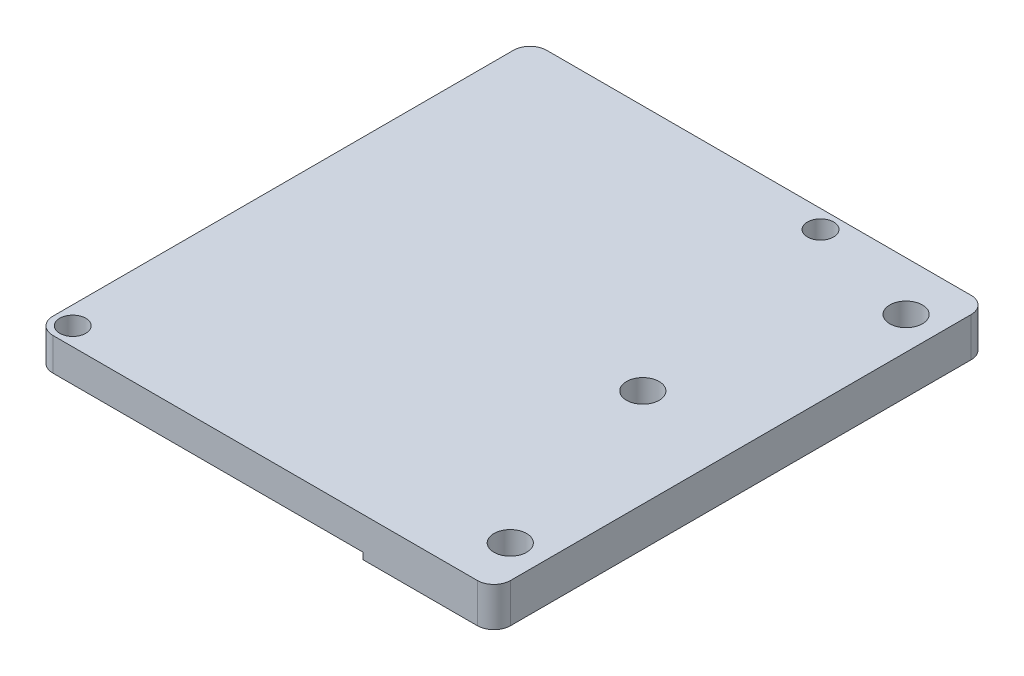
ISO-10303-21;
HEADER;
FILE_DESCRIPTION(('STEP AP214'),'2;1');
FILE_NAME('part.step','',(''),(''),'','','');
FILE_SCHEMA(('AUTOMOTIVE_DESIGN { 1 0 10303 214 1 1 1 1 }'));
ENDSEC;
DATA;
#1=APPLICATION_CONTEXT('core data for automotive mechanical design processes');
#2=APPLICATION_PROTOCOL_DEFINITION('international standard','automotive_design',2000,#1);
#3=PRODUCT_CONTEXT('',#1,'mechanical');
#4=PRODUCT('Part','Part','',(#3));
#5=PRODUCT_RELATED_PRODUCT_CATEGORY('part','',(#4));
#6=PRODUCT_DEFINITION_FORMATION('','',#4);
#7=PRODUCT_DEFINITION_CONTEXT('part definition',#1,'design');
#8=PRODUCT_DEFINITION('design','',#6,#7);
#9=PRODUCT_DEFINITION_SHAPE('','',#8);
#10=(LENGTH_UNIT() NAMED_UNIT(*) SI_UNIT(.MILLI.,.METRE.));
#11=(NAMED_UNIT(*) PLANE_ANGLE_UNIT() SI_UNIT($,.RADIAN.));
#12=(NAMED_UNIT(*) SI_UNIT($,.STERADIAN.) SOLID_ANGLE_UNIT());
#13=UNCERTAINTY_MEASURE_WITH_UNIT(LENGTH_MEASURE(1.E-05),#10,'distance_accuracy_value','');
#14=(GEOMETRIC_REPRESENTATION_CONTEXT(3) GLOBAL_UNCERTAINTY_ASSIGNED_CONTEXT((#13)) GLOBAL_UNIT_ASSIGNED_CONTEXT((#10,
#11,#12)) REPRESENTATION_CONTEXT('',''));
#15=CARTESIAN_POINT('',(0.,0.,0.));
#16=DIRECTION('',(0.,0.,1.));
#17=DIRECTION('',(1.,0.,0.));
#18=AXIS2_PLACEMENT_3D('',#15,#16,#17);
#19=CARTESIAN_POINT('',(60.038,-0.001000000000001,-60.565));
#20=DIRECTION('',(0.,1.,0.));
#21=DIRECTION('',(0.,0.,1.));
#22=AXIS2_PLACEMENT_3D('',#19,#20,#21);
#23=CYLINDRICAL_SURFACE('',#22,2.75000000000002);
#24=CARTESIAN_POINT('',(60.038,0.,-60.565));
#25=DIRECTION('',(0.,1.,0.));
#26=DIRECTION('',(0.,0.,1.));
#27=AXIS2_PLACEMENT_3D('',#24,#25,#26);
#28=CIRCLE('',#27,2.75000000000002);
#29=CARTESIAN_POINT('',(60.038,0.,-57.815));
#30=VERTEX_POINT('',#29);
#31=EDGE_CURVE('E215',#30,#30,#28,.F.);
#32=ORIENTED_EDGE('',*,*,#31,.T.);
#33=EDGE_LOOP('',(#32));
#34=FACE_BOUND('',#33,.T.);
#35=CARTESIAN_POINT('',(60.038,3.,-60.565));
#36=DIRECTION('',(0.,1.,0.));
#37=DIRECTION('',(0.,0.,1.));
#38=AXIS2_PLACEMENT_3D('',#35,#36,#37);
#39=CIRCLE('',#38,2.75000000000002);
#40=CARTESIAN_POINT('',(60.038,3.,-57.815));
#41=VERTEX_POINT('',#40);
#42=EDGE_CURVE('E58',#41,#41,#39,.F.);
#43=ORIENTED_EDGE('',*,*,#42,.F.);
#44=EDGE_LOOP('',(#43));
#45=FACE_BOUND('',#44,.T.);
#46=ADVANCED_FACE('F54',(#34,#45),#23,.F.);
#47=CARTESIAN_POINT('',(60.038,-0.001000000000001,60.565));
#48=DIRECTION('',(0.,1.,0.));
#49=DIRECTION('',(0.,0.,1.));
#50=AXIS2_PLACEMENT_3D('',#47,#48,#49);
#51=CYLINDRICAL_SURFACE('',#50,2.75000000000002);
#52=CARTESIAN_POINT('',(60.038,0.,60.565));
#53=DIRECTION('',(0.,1.,0.));
#54=DIRECTION('',(0.,0.,1.));
#55=AXIS2_PLACEMENT_3D('',#52,#53,#54);
#56=CIRCLE('',#55,2.75000000000002);
#57=CARTESIAN_POINT('',(60.038,0.,63.315));
#58=VERTEX_POINT('',#57);
#59=EDGE_CURVE('E219',#58,#58,#56,.F.);
#60=ORIENTED_EDGE('',*,*,#59,.T.);
#61=EDGE_LOOP('',(#60));
#62=FACE_BOUND('',#61,.T.);
#63=CARTESIAN_POINT('',(60.038,3.,60.565));
#64=DIRECTION('',(0.,1.,0.));
#65=DIRECTION('',(0.,0.,1.));
#66=AXIS2_PLACEMENT_3D('',#63,#64,#65);
#67=CIRCLE('',#66,2.75000000000002);
#68=CARTESIAN_POINT('',(60.038,3.,63.315));
#69=VERTEX_POINT('',#68);
#70=EDGE_CURVE('E209',#69,#69,#67,.F.);
#71=ORIENTED_EDGE('',*,*,#70,.F.);
#72=EDGE_LOOP('',(#71));
#73=FACE_BOUND('',#72,.T.);
#74=ADVANCED_FACE('F283',(#62,#73),#51,.F.);
#75=CARTESIAN_POINT('',(40.038,-0.001000000000001,0.));
#76=DIRECTION('',(0.,1.,0.));
#77=DIRECTION('',(0.,0.,1.));
#78=AXIS2_PLACEMENT_3D('',#75,#76,#77);
#79=CYLINDRICAL_SURFACE('',#78,2.75);
#80=CARTESIAN_POINT('',(40.038,0.,0.));
#81=DIRECTION('',(0.,1.,0.));
#82=DIRECTION('',(0.,0.,1.));
#83=AXIS2_PLACEMENT_3D('',#80,#81,#82);
#84=CIRCLE('',#83,2.75);
#85=CARTESIAN_POINT('',(40.038,0.,2.75));
#86=VERTEX_POINT('',#85);
#87=EDGE_CURVE('E224',#86,#86,#84,.F.);
#88=ORIENTED_EDGE('',*,*,#87,.T.);
#89=EDGE_LOOP('',(#88));
#90=FACE_BOUND('',#89,.T.);
#91=CARTESIAN_POINT('',(40.038,3.,0.));
#92=DIRECTION('',(0.,1.,0.));
#93=DIRECTION('',(0.,0.,1.));
#94=AXIS2_PLACEMENT_3D('',#91,#92,#93);
#95=CIRCLE('',#94,2.75);
#96=CARTESIAN_POINT('',(40.038,3.,2.75));
#97=VERTEX_POINT('',#96);
#98=EDGE_CURVE('E207',#97,#97,#95,.F.);
#99=ORIENTED_EDGE('',*,*,#98,.F.);
#100=EDGE_LOOP('',(#99));
#101=FACE_BOUND('',#100,.T.);
#102=ADVANCED_FACE('F288',(#90,#101),#79,.F.);
#103=CARTESIAN_POINT('',(-70.038,12.,-75.565));
#104=DIRECTION('',(1.,0.,0.));
#105=DIRECTION('',(0.,0.,-1.));
#106=AXIS2_PLACEMENT_3D('',#103,#104,#105);
#107=PLANE('',#106);
#108=DIRECTION('',(0.,0.,-1.));
#109=VECTOR('',#108,1.);
#110=CARTESIAN_POINT('',(-70.038,2.,75.565));
#111=LINE('',#110,#109);
#112=CARTESIAN_POINT('',(-70.038,2.,70.485));
#113=VERTEX_POINT('',#112);
#114=CARTESIAN_POINT('',(-70.038,2.,-70.485));
#115=VERTEX_POINT('',#114);
#116=EDGE_CURVE('E138',#113,#115,#111,.T.);
#117=ORIENTED_EDGE('',*,*,#116,.F.);
#118=DIRECTION('',(0.,-1.,0.));
#119=VECTOR('',#118,1.);
#120=CARTESIAN_POINT('',(-70.038,12.,70.485));
#121=LINE('',#120,#119);
#122=CARTESIAN_POINT('',(-70.038,12.,70.485));
#123=VERTEX_POINT('',#122);
#124=EDGE_CURVE('E204',#113,#123,#121,.F.);
#125=ORIENTED_EDGE('',*,*,#124,.T.);
#126=DIRECTION('',(0.,0.,1.));
#127=VECTOR('',#126,1.);
#128=CARTESIAN_POINT('',(-70.038,12.,-75.565));
#129=LINE('',#128,#127);
#130=CARTESIAN_POINT('',(-70.038,12.,-70.485));
#131=VERTEX_POINT('',#130);
#132=EDGE_CURVE('E166',#131,#123,#129,.T.);
#133=ORIENTED_EDGE('',*,*,#132,.F.);
#134=DIRECTION('',(0.,-1.,0.));
#135=VECTOR('',#134,1.);
#136=CARTESIAN_POINT('',(-70.038,12.,-70.485));
#137=LINE('',#136,#135);
#138=EDGE_CURVE('E202',#131,#115,#137,.T.);
#139=ORIENTED_EDGE('',*,*,#138,.T.);
#140=EDGE_LOOP('',(#117,#125,#133,#139));
#141=FACE_BOUND('',#140,.T.);
#142=ADVANCED_FACE('F267',(#141),#107,.F.);
#143=CARTESIAN_POINT('',(70.038,12.,-75.565));
#144=DIRECTION('',(-1.,0.,0.));
#145=DIRECTION('',(0.,0.,1.));
#146=AXIS2_PLACEMENT_3D('',#143,#144,#145);
#147=PLANE('',#146);
#148=DIRECTION('',(0.,0.,-1.));
#149=VECTOR('',#148,1.);
#150=CARTESIAN_POINT('',(70.038,12.,-75.565));
#151=LINE('',#150,#149);
#152=CARTESIAN_POINT('',(70.038,12.,70.485));
#153=VERTEX_POINT('',#152);
#154=CARTESIAN_POINT('',(70.038,12.,-70.485));
#155=VERTEX_POINT('',#154);
#156=EDGE_CURVE('E159',#153,#155,#151,.T.);
#157=ORIENTED_EDGE('',*,*,#156,.F.);
#158=DIRECTION('',(0.,-1.,0.));
#159=VECTOR('',#158,1.);
#160=CARTESIAN_POINT('',(70.038,12.,70.485));
#161=LINE('',#160,#159);
#162=CARTESIAN_POINT('',(70.038,0.,70.485));
#163=VERTEX_POINT('',#162);
#164=EDGE_CURVE('E179',#153,#163,#161,.T.);
#165=ORIENTED_EDGE('',*,*,#164,.T.);
#166=DIRECTION('',(0.,0.,-1.));
#167=VECTOR('',#166,1.);
#168=CARTESIAN_POINT('',(70.038,0.,-75.565));
#169=LINE('',#168,#167);
#170=CARTESIAN_POINT('',(70.038,0.,-70.485));
#171=VERTEX_POINT('',#170);
#172=EDGE_CURVE('E154',#163,#171,#169,.T.);
#173=ORIENTED_EDGE('',*,*,#172,.T.);
#174=DIRECTION('',(0.,-1.,0.));
#175=VECTOR('',#174,1.);
#176=CARTESIAN_POINT('',(70.038,12.,-70.485));
#177=LINE('',#176,#175);
#178=EDGE_CURVE('E172',#171,#155,#177,.F.);
#179=ORIENTED_EDGE('',*,*,#178,.T.);
#180=EDGE_LOOP('',(#157,#165,#173,#179));
#181=FACE_BOUND('',#180,.T.);
#182=ADVANCED_FACE('F254',(#181),#147,.F.);
#183=CARTESIAN_POINT('',(-70.038,12.,-75.565));
#184=DIRECTION('',(0.,0.,1.));
#185=DIRECTION('',(1.,0.,0.));
#186=AXIS2_PLACEMENT_3D('',#183,#184,#185);
#187=PLANE('',#186);
#188=DIRECTION('',(1.,0.,0.));
#189=VECTOR('',#188,1.);
#190=CARTESIAN_POINT('',(-70.038,2.,-75.565));
#191=LINE('',#190,#189);
#192=CARTESIAN_POINT('',(-64.958,2.,-75.565));
#193=VERTEX_POINT('',#192);
#194=CARTESIAN_POINT('',(30.038,2.,-75.565));
#195=VERTEX_POINT('',#194);
#196=EDGE_CURVE('E130',#193,#195,#191,.T.);
#197=ORIENTED_EDGE('',*,*,#196,.F.);
#198=DIRECTION('',(0.,-1.,0.));
#199=VECTOR('',#198,1.);
#200=CARTESIAN_POINT('',(-64.958,12.,-75.565));
#201=LINE('',#200,#199);
#202=CARTESIAN_POINT('',(-64.958,12.,-75.565));
#203=VERTEX_POINT('',#202);
#204=EDGE_CURVE('E14',#193,#203,#201,.F.);
#205=ORIENTED_EDGE('',*,*,#204,.T.);
#206=DIRECTION('',(-1.,0.,0.));
#207=VECTOR('',#206,1.);
#208=CARTESIAN_POINT('',(-70.038,12.,-75.565));
#209=LINE('',#208,#207);
#210=CARTESIAN_POINT('',(64.958,12.,-75.565));
#211=VERTEX_POINT('',#210);
#212=EDGE_CURVE('E162',#211,#203,#209,.T.);
#213=ORIENTED_EDGE('',*,*,#212,.F.);
#214=DIRECTION('',(0.,-1.,0.));
#215=VECTOR('',#214,1.);
#216=CARTESIAN_POINT('',(64.958,12.,-75.565));
#217=LINE('',#216,#215);
#218=CARTESIAN_POINT('',(64.958,0.,-75.565));
#219=VERTEX_POINT('',#218);
#220=EDGE_CURVE('E63',#211,#219,#217,.T.);
#221=ORIENTED_EDGE('',*,*,#220,.T.);
#222=DIRECTION('',(-1.,0.,0.));
#223=VECTOR('',#222,1.);
#224=CARTESIAN_POINT('',(-70.038,0.,-75.565));
#225=LINE('',#224,#223);
#226=CARTESIAN_POINT('',(30.038,0.,-75.565));
#227=VERTEX_POINT('',#226);
#228=EDGE_CURVE('E152',#219,#227,#225,.T.);
#229=ORIENTED_EDGE('',*,*,#228,.T.);
#230=DIRECTION('',(0.,-1.,0.));
#231=VECTOR('',#230,1.);
#232=CARTESIAN_POINT('',(30.038,2.,-75.565));
#233=LINE('',#232,#231);
#234=EDGE_CURVE('E143',#195,#227,#233,.T.);
#235=ORIENTED_EDGE('',*,*,#234,.F.);
#236=EDGE_LOOP('',(#197,#205,#213,#221,#229,#235));
#237=FACE_BOUND('',#236,.T.);
#238=ADVANCED_FACE('F149',(#237),#187,.F.);
#239=CARTESIAN_POINT('',(-70.038,12.,75.565));
#240=DIRECTION('',(0.,0.,-1.));
#241=DIRECTION('',(-1.,0.,0.));
#242=AXIS2_PLACEMENT_3D('',#239,#240,#241);
#243=PLANE('',#242);
#244=DIRECTION('',(1.,0.,0.));
#245=VECTOR('',#244,1.);
#246=CARTESIAN_POINT('',(-70.038,0.,75.565));
#247=LINE('',#246,#245);
#248=CARTESIAN_POINT('',(30.038,0.,75.565));
#249=VERTEX_POINT('',#248);
#250=CARTESIAN_POINT('',(64.958,0.,75.565));
#251=VERTEX_POINT('',#250);
#252=EDGE_CURVE('E163',#249,#251,#247,.T.);
#253=ORIENTED_EDGE('',*,*,#252,.T.);
#254=DIRECTION('',(0.,-1.,0.));
#255=VECTOR('',#254,1.);
#256=CARTESIAN_POINT('',(64.958,12.,75.565));
#257=LINE('',#256,#255);
#258=CARTESIAN_POINT('',(64.958,12.,75.565));
#259=VERTEX_POINT('',#258);
#260=EDGE_CURVE('E189',#251,#259,#257,.F.);
#261=ORIENTED_EDGE('',*,*,#260,.T.);
#262=DIRECTION('',(1.,0.,0.));
#263=VECTOR('',#262,1.);
#264=CARTESIAN_POINT('',(-70.038,12.,75.565));
#265=LINE('',#264,#263);
#266=CARTESIAN_POINT('',(-64.958,12.,75.565));
#267=VERTEX_POINT('',#266);
#268=EDGE_CURVE('E169',#267,#259,#265,.T.);
#269=ORIENTED_EDGE('',*,*,#268,.F.);
#270=DIRECTION('',(0.,-1.,0.));
#271=VECTOR('',#270,1.);
#272=CARTESIAN_POINT('',(-64.958,12.,75.565));
#273=LINE('',#272,#271);
#274=CARTESIAN_POINT('',(-64.958,2.,75.565));
#275=VERTEX_POINT('',#274);
#276=EDGE_CURVE('E186',#267,#275,#273,.T.);
#277=ORIENTED_EDGE('',*,*,#276,.T.);
#278=DIRECTION('',(-1.,0.,0.));
#279=VECTOR('',#278,1.);
#280=CARTESIAN_POINT('',(-70.038,2.,75.565));
#281=LINE('',#280,#279);
#282=CARTESIAN_POINT('',(30.038,2.,75.565));
#283=VERTEX_POINT('',#282);
#284=EDGE_CURVE('E147',#283,#275,#281,.T.);
#285=ORIENTED_EDGE('',*,*,#284,.F.);
#286=DIRECTION('',(0.,-1.,0.));
#287=VECTOR('',#286,1.);
#288=CARTESIAN_POINT('',(30.038,2.,75.565));
#289=LINE('',#288,#287);
#290=EDGE_CURVE('E146',#283,#249,#289,.T.);
#291=ORIENTED_EDGE('',*,*,#290,.T.);
#292=EDGE_LOOP('',(#253,#261,#269,#277,#285,#291));
#293=FACE_BOUND('',#292,.T.);
#294=ADVANCED_FACE('F244',(#293),#243,.F.);
#295=CARTESIAN_POINT('',(0.,12.,0.));
#296=DIRECTION('',(0.,1.,0.));
#297=DIRECTION('',(0.,0.,1.));
#298=AXIS2_PLACEMENT_3D('',#295,#296,#297);
#299=PLANE('',#298);
#300=CARTESIAN_POINT('',(60.038,12.,-60.565));
#301=DIRECTION('',(0.,1.,0.));
#302=DIRECTION('',(0.,0.,1.));
#303=AXIS2_PLACEMENT_3D('',#300,#301,#302);
#304=CIRCLE('',#303,5.);
#305=CARTESIAN_POINT('',(60.038,12.,-55.565));
#306=VERTEX_POINT('',#305);
#307=EDGE_CURVE('E452',#306,#306,#304,.T.);
#308=ORIENTED_EDGE('',*,*,#307,.F.);
#309=EDGE_LOOP('',(#308));
#310=FACE_BOUND('',#309,.T.);
#311=CARTESIAN_POINT('',(40.038,12.,0.));
#312=DIRECTION('',(0.,1.,0.));
#313=DIRECTION('',(0.,0.,1.));
#314=AXIS2_PLACEMENT_3D('',#311,#312,#313);
#315=CIRCLE('',#314,5.);
#316=CARTESIAN_POINT('',(40.038,12.,5.));
#317=VERTEX_POINT('',#316);
#318=EDGE_CURVE('E457',#317,#317,#315,.T.);
#319=ORIENTED_EDGE('',*,*,#318,.F.);
#320=EDGE_LOOP('',(#319));
#321=FACE_BOUND('',#320,.T.);
#322=CARTESIAN_POINT('',(60.038,12.,60.565));
#323=DIRECTION('',(0.,1.,0.));
#324=DIRECTION('',(0.,0.,1.));
#325=AXIS2_PLACEMENT_3D('',#322,#323,#324);
#326=CIRCLE('',#325,5.);
#327=CARTESIAN_POINT('',(60.038,12.,65.565));
#328=VERTEX_POINT('',#327);
#329=EDGE_CURVE('E463',#328,#328,#326,.T.);
#330=ORIENTED_EDGE('',*,*,#329,.F.);
#331=EDGE_LOOP('',(#330));
#332=FACE_BOUND('',#331,.T.);
#333=CARTESIAN_POINT('',(24.4499999999999,12.,-69.977));
#334=DIRECTION('',(0.,1.,0.));
#335=DIRECTION('',(0.,0.,1.));
#336=AXIS2_PLACEMENT_3D('',#333,#334,#335);
#337=CIRCLE('',#336,4.);
#338=CARTESIAN_POINT('',(24.4499999999999,12.,-65.977));
#339=VERTEX_POINT('',#338);
#340=EDGE_CURVE('E232',#339,#339,#337,.T.);
#341=ORIENTED_EDGE('',*,*,#340,.F.);
#342=EDGE_LOOP('',(#341));
#343=FACE_BOUND('',#342,.T.);
#344=CARTESIAN_POINT('',(-64.45,12.,69.977));
#345=DIRECTION('',(0.,1.,0.));
#346=DIRECTION('',(0.,0.,1.));
#347=AXIS2_PLACEMENT_3D('',#344,#345,#346);
#348=CIRCLE('',#347,4.00000000000001);
#349=CARTESIAN_POINT('',(-64.45,12.,73.977));
#350=VERTEX_POINT('',#349);
#351=EDGE_CURVE('E238',#350,#350,#348,.T.);
#352=ORIENTED_EDGE('',*,*,#351,.F.);
#353=EDGE_LOOP('',(#352));
#354=FACE_BOUND('',#353,.T.);
#355=ORIENTED_EDGE('',*,*,#268,.T.);
#356=CARTESIAN_POINT('',(64.958,12.,70.485));
#357=DIRECTION('',(0.,1.,0.));
#358=DIRECTION('',(0.,0.,1.));
#359=AXIS2_PLACEMENT_3D('',#356,#357,#358);
#360=CIRCLE('',#359,5.08);
#361=EDGE_CURVE('E197',#259,#153,#360,.T.);
#362=ORIENTED_EDGE('',*,*,#361,.T.);
#363=ORIENTED_EDGE('',*,*,#156,.T.);
#364=CARTESIAN_POINT('',(64.958,12.,-70.485));
#365=DIRECTION('',(0.,1.,0.));
#366=DIRECTION('',(0.,0.,1.));
#367=AXIS2_PLACEMENT_3D('',#364,#365,#366);
#368=CIRCLE('',#367,5.08);
#369=EDGE_CURVE('E191',#155,#211,#368,.T.);
#370=ORIENTED_EDGE('',*,*,#369,.T.);
#371=ORIENTED_EDGE('',*,*,#212,.T.);
#372=CARTESIAN_POINT('',(-64.958,12.,-70.485));
#373=DIRECTION('',(0.,1.,0.));
#374=DIRECTION('',(0.,0.,1.));
#375=AXIS2_PLACEMENT_3D('',#372,#373,#374);
#376=CIRCLE('',#375,5.08);
#377=EDGE_CURVE('E193',#203,#131,#376,.T.);
#378=ORIENTED_EDGE('',*,*,#377,.T.);
#379=ORIENTED_EDGE('',*,*,#132,.T.);
#380=CARTESIAN_POINT('',(-64.958,12.,70.485));
#381=DIRECTION('',(0.,1.,0.));
#382=DIRECTION('',(0.,0.,1.));
#383=AXIS2_PLACEMENT_3D('',#380,#381,#382);
#384=CIRCLE('',#383,5.08);
#385=EDGE_CURVE('E195',#123,#267,#384,.T.);
#386=ORIENTED_EDGE('',*,*,#385,.T.);
#387=EDGE_LOOP('',(#355,#362,#363,#370,#371,#378,#379,#386));
#388=FACE_BOUND('',#387,.T.);
#389=ADVANCED_FACE('F258',(#310,#321,#332,#343,#354,#388),#299,.T.);
#390=CARTESIAN_POINT('',(0.,0.,0.));
#391=DIRECTION('',(0.,1.,0.));
#392=DIRECTION('',(0.,0.,1.));
#393=AXIS2_PLACEMENT_3D('',#390,#391,#392);
#394=PLANE('',#393);
#395=ORIENTED_EDGE('',*,*,#87,.F.);
#396=EDGE_LOOP('',(#395));
#397=FACE_BOUND('',#396,.T.);
#398=ORIENTED_EDGE('',*,*,#59,.F.);
#399=EDGE_LOOP('',(#398));
#400=FACE_BOUND('',#399,.T.);
#401=ORIENTED_EDGE('',*,*,#31,.F.);
#402=EDGE_LOOP('',(#401));
#403=FACE_BOUND('',#402,.T.);
#404=ORIENTED_EDGE('',*,*,#172,.F.);
#405=CARTESIAN_POINT('',(64.958,0.,70.485));
#406=DIRECTION('',(0.,1.,0.));
#407=DIRECTION('',(0.,0.,1.));
#408=AXIS2_PLACEMENT_3D('',#405,#406,#407);
#409=CIRCLE('',#408,5.08);
#410=EDGE_CURVE('E184',#163,#251,#409,.F.);
#411=ORIENTED_EDGE('',*,*,#410,.T.);
#412=ORIENTED_EDGE('',*,*,#252,.F.);
#413=DIRECTION('',(0.,0.,1.));
#414=VECTOR('',#413,1.);
#415=CARTESIAN_POINT('',(30.038,0.,75.565));
#416=LINE('',#415,#414);
#417=EDGE_CURVE('E231',#227,#249,#416,.T.);
#418=ORIENTED_EDGE('',*,*,#417,.F.);
#419=ORIENTED_EDGE('',*,*,#228,.F.);
#420=CARTESIAN_POINT('',(64.958,0.,-70.485));
#421=DIRECTION('',(0.,1.,0.));
#422=DIRECTION('',(0.,0.,1.));
#423=AXIS2_PLACEMENT_3D('',#420,#421,#422);
#424=CIRCLE('',#423,5.08);
#425=EDGE_CURVE('E182',#219,#171,#424,.F.);
#426=ORIENTED_EDGE('',*,*,#425,.T.);
#427=EDGE_LOOP('',(#404,#411,#412,#418,#419,#426));
#428=FACE_BOUND('',#427,.T.);
#429=ADVANCED_FACE('F247',(#397,#400,#403,#428),#394,.F.);
#430=CARTESIAN_POINT('',(30.038,2.,75.565));
#431=DIRECTION('',(1.,0.,0.));
#432=DIRECTION('',(0.,0.,-1.));
#433=AXIS2_PLACEMENT_3D('',#430,#431,#432);
#434=PLANE('',#433);
#435=ORIENTED_EDGE('',*,*,#417,.T.);
#436=ORIENTED_EDGE('',*,*,#290,.F.);
#437=DIRECTION('',(0.,0.,1.));
#438=VECTOR('',#437,1.);
#439=CARTESIAN_POINT('',(30.038,2.,75.565));
#440=LINE('',#439,#438);
#441=EDGE_CURVE('E134',#195,#283,#440,.T.);
#442=ORIENTED_EDGE('',*,*,#441,.F.);
#443=ORIENTED_EDGE('',*,*,#234,.T.);
#444=EDGE_LOOP('',(#435,#436,#442,#443));
#445=FACE_BOUND('',#444,.T.);
#446=ADVANCED_FACE('F142',(#445),#434,.F.);
#447=CARTESIAN_POINT('',(0.,2.,0.));
#448=DIRECTION('',(0.,-1.,0.));
#449=DIRECTION('',(0.,0.,-1.));
#450=AXIS2_PLACEMENT_3D('',#447,#448,#449);
#451=PLANE('',#450);
#452=ORIENTED_EDGE('',*,*,#284,.T.);
#453=CARTESIAN_POINT('',(-64.958,2.,70.485));
#454=DIRECTION('',(0.,-1.,0.));
#455=DIRECTION('',(0.,0.,-1.));
#456=AXIS2_PLACEMENT_3D('',#453,#454,#455);
#457=CIRCLE('',#456,5.08);
#458=EDGE_CURVE('E200',#275,#113,#457,.T.);
#459=ORIENTED_EDGE('',*,*,#458,.T.);
#460=ORIENTED_EDGE('',*,*,#116,.T.);
#461=CARTESIAN_POINT('',(-64.958,2.,-70.485));
#462=DIRECTION('',(0.,-1.,0.));
#463=DIRECTION('',(0.,0.,-1.));
#464=AXIS2_PLACEMENT_3D('',#461,#462,#463);
#465=CIRCLE('',#464,5.08);
#466=EDGE_CURVE('E71',#115,#193,#465,.T.);
#467=ORIENTED_EDGE('',*,*,#466,.T.);
#468=ORIENTED_EDGE('',*,*,#196,.T.);
#469=ORIENTED_EDGE('',*,*,#441,.T.);
#470=EDGE_LOOP('',(#452,#459,#460,#467,#468,#469));
#471=FACE_BOUND('',#470,.T.);
#472=ADVANCED_FACE('F133',(#471),#451,.T.);
#473=CARTESIAN_POINT('',(-64.45,4.,69.977));
#474=DIRECTION('',(0.,1.,0.));
#475=DIRECTION('',(0.,0.,1.));
#476=AXIS2_PLACEMENT_3D('',#473,#474,#475);
#477=CYLINDRICAL_SURFACE('',#476,4.00000000000001);
#478=CARTESIAN_POINT('',(-64.45,4.,69.977));
#479=DIRECTION('',(0.,1.,0.));
#480=DIRECTION('',(0.,0.,1.));
#481=AXIS2_PLACEMENT_3D('',#478,#479,#480);
#482=CIRCLE('',#481,4.00000000000001);
#483=CARTESIAN_POINT('',(-64.45,4.,73.977));
#484=VERTEX_POINT('',#483);
#485=EDGE_CURVE('E235',#484,#484,#482,.T.);
#486=ORIENTED_EDGE('',*,*,#485,.F.);
#487=EDGE_LOOP('',(#486));
#488=FACE_BOUND('',#487,.T.);
#489=ORIENTED_EDGE('',*,*,#351,.T.);
#490=EDGE_LOOP('',(#489));
#491=FACE_BOUND('',#490,.T.);
#492=ADVANCED_FACE('F304',(#488,#491),#477,.F.);
#493=CARTESIAN_POINT('',(-64.45,4.,69.977));
#494=DIRECTION('',(0.,1.,0.));
#495=DIRECTION('',(0.,0.,1.));
#496=AXIS2_PLACEMENT_3D('',#493,#494,#495);
#497=PLANE('',#496);
#498=ORIENTED_EDGE('',*,*,#485,.T.);
#499=EDGE_LOOP('',(#498));
#500=FACE_BOUND('',#499,.T.);
#501=ADVANCED_FACE('F300',(#500),#497,.T.);
#502=CARTESIAN_POINT('',(24.4499999999999,4.,-69.977));
#503=DIRECTION('',(0.,1.,0.));
#504=DIRECTION('',(0.,0.,1.));
#505=AXIS2_PLACEMENT_3D('',#502,#503,#504);
#506=CYLINDRICAL_SURFACE('',#505,4.);
#507=CARTESIAN_POINT('',(24.4499999999999,4.,-69.977));
#508=DIRECTION('',(0.,1.,0.));
#509=DIRECTION('',(0.,0.,1.));
#510=AXIS2_PLACEMENT_3D('',#507,#508,#509);
#511=CIRCLE('',#510,4.);
#512=CARTESIAN_POINT('',(24.4499999999999,4.,-65.977));
#513=VERTEX_POINT('',#512);
#514=EDGE_CURVE('E228',#513,#513,#511,.T.);
#515=ORIENTED_EDGE('',*,*,#514,.F.);
#516=EDGE_LOOP('',(#515));
#517=FACE_BOUND('',#516,.T.);
#518=ORIENTED_EDGE('',*,*,#340,.T.);
#519=EDGE_LOOP('',(#518));
#520=FACE_BOUND('',#519,.T.);
#521=ADVANCED_FACE('F296',(#517,#520),#506,.F.);
#522=CARTESIAN_POINT('',(24.4499999999999,4.,-69.977));
#523=DIRECTION('',(0.,1.,0.));
#524=DIRECTION('',(0.,0.,1.));
#525=AXIS2_PLACEMENT_3D('',#522,#523,#524);
#526=PLANE('',#525);
#527=ORIENTED_EDGE('',*,*,#514,.T.);
#528=EDGE_LOOP('',(#527));
#529=FACE_BOUND('',#528,.T.);
#530=ADVANCED_FACE('F280',(#529),#526,.T.);
#531=CARTESIAN_POINT('',(64.958,12.,70.485));
#532=DIRECTION('',(0.,-1.,0.));
#533=DIRECTION('',(0.,0.,-1.));
#534=AXIS2_PLACEMENT_3D('',#531,#532,#533);
#535=CYLINDRICAL_SURFACE('',#534,5.08);
#536=ORIENTED_EDGE('',*,*,#361,.F.);
#537=ORIENTED_EDGE('',*,*,#260,.F.);
#538=ORIENTED_EDGE('',*,*,#410,.F.);
#539=ORIENTED_EDGE('',*,*,#164,.F.);
#540=EDGE_LOOP('',(#536,#537,#538,#539));
#541=FACE_BOUND('',#540,.T.);
#542=ADVANCED_FACE('F251',(#541),#535,.T.);
#543=CARTESIAN_POINT('',(-64.958,12.,70.485));
#544=DIRECTION('',(0.,-1.,0.));
#545=DIRECTION('',(0.,0.,-1.));
#546=AXIS2_PLACEMENT_3D('',#543,#544,#545);
#547=CYLINDRICAL_SURFACE('',#546,5.08);
#548=ORIENTED_EDGE('',*,*,#385,.F.);
#549=ORIENTED_EDGE('',*,*,#124,.F.);
#550=ORIENTED_EDGE('',*,*,#458,.F.);
#551=ORIENTED_EDGE('',*,*,#276,.F.);
#552=EDGE_LOOP('',(#548,#549,#550,#551));
#553=FACE_BOUND('',#552,.T.);
#554=ADVANCED_FACE('F272',(#553),#547,.T.);
#555=CARTESIAN_POINT('',(-64.958,12.,-70.485));
#556=DIRECTION('',(0.,-1.,0.));
#557=DIRECTION('',(0.,0.,-1.));
#558=AXIS2_PLACEMENT_3D('',#555,#556,#557);
#559=CYLINDRICAL_SURFACE('',#558,5.08);
#560=ORIENTED_EDGE('',*,*,#377,.F.);
#561=ORIENTED_EDGE('',*,*,#204,.F.);
#562=ORIENTED_EDGE('',*,*,#466,.F.);
#563=ORIENTED_EDGE('',*,*,#138,.F.);
#564=EDGE_LOOP('',(#560,#561,#562,#563));
#565=FACE_BOUND('',#564,.T.);
#566=ADVANCED_FACE('F264',(#565),#559,.T.);
#567=CARTESIAN_POINT('',(64.958,12.,-70.485));
#568=DIRECTION('',(0.,-1.,0.));
#569=DIRECTION('',(0.,0.,-1.));
#570=AXIS2_PLACEMENT_3D('',#567,#568,#569);
#571=CYLINDRICAL_SURFACE('',#570,5.08);
#572=ORIENTED_EDGE('',*,*,#369,.F.);
#573=ORIENTED_EDGE('',*,*,#178,.F.);
#574=ORIENTED_EDGE('',*,*,#425,.F.);
#575=ORIENTED_EDGE('',*,*,#220,.F.);
#576=EDGE_LOOP('',(#572,#573,#574,#575));
#577=FACE_BOUND('',#576,.T.);
#578=ADVANCED_FACE('F56',(#577),#571,.T.);
#579=CARTESIAN_POINT('',(0.,3.,0.));
#580=DIRECTION('',(0.,1.,0.));
#581=DIRECTION('',(0.,0.,1.));
#582=AXIS2_PLACEMENT_3D('',#579,#580,#581);
#583=PLANE('',#582);
#584=CARTESIAN_POINT('',(40.038,3.,0.));
#585=DIRECTION('',(0.,1.,0.));
#586=DIRECTION('',(0.,0.,1.));
#587=AXIS2_PLACEMENT_3D('',#584,#585,#586);
#588=CIRCLE('',#587,5.);
#589=CARTESIAN_POINT('',(40.038,3.,5.));
#590=VERTEX_POINT('',#589);
#591=EDGE_CURVE('E453',#590,#590,#588,.F.);
#592=ORIENTED_EDGE('',*,*,#591,.F.);
#593=EDGE_LOOP('',(#592));
#594=FACE_BOUND('',#593,.T.);
#595=ORIENTED_EDGE('',*,*,#98,.T.);
#596=EDGE_LOOP('',(#595));
#597=FACE_BOUND('',#596,.T.);
#598=ADVANCED_FACE('F388',(#594,#597),#583,.T.);
#599=CARTESIAN_POINT('',(40.038,-14.1421356237309,0.));
#600=DIRECTION('',(0.,1.,0.));
#601=DIRECTION('',(0.,0.,1.));
#602=AXIS2_PLACEMENT_3D('',#599,#600,#601);
#603=CYLINDRICAL_SURFACE('',#602,5.);
#604=ORIENTED_EDGE('',*,*,#591,.T.);
#605=EDGE_LOOP('',(#604));
#606=FACE_BOUND('',#605,.T.);
#607=ORIENTED_EDGE('',*,*,#318,.T.);
#608=EDGE_LOOP('',(#607));
#609=FACE_BOUND('',#608,.T.);
#610=ADVANCED_FACE('F405',(#606,#609),#603,.F.);
#611=CARTESIAN_POINT('',(0.,3.,0.));
#612=DIRECTION('',(0.,1.,0.));
#613=DIRECTION('',(0.,0.,1.));
#614=AXIS2_PLACEMENT_3D('',#611,#612,#613);
#615=PLANE('',#614);
#616=CARTESIAN_POINT('',(60.038,3.,60.565));
#617=DIRECTION('',(0.,1.,0.));
#618=DIRECTION('',(0.,0.,1.));
#619=AXIS2_PLACEMENT_3D('',#616,#617,#618);
#620=CIRCLE('',#619,5.);
#621=CARTESIAN_POINT('',(60.038,3.,65.565));
#622=VERTEX_POINT('',#621);
#623=EDGE_CURVE('E461',#622,#622,#620,.F.);
#624=ORIENTED_EDGE('',*,*,#623,.F.);
#625=EDGE_LOOP('',(#624));
#626=FACE_BOUND('',#625,.T.);
#627=ORIENTED_EDGE('',*,*,#70,.T.);
#628=EDGE_LOOP('',(#627));
#629=FACE_BOUND('',#628,.T.);
#630=ADVANCED_FACE('F413',(#626,#629),#615,.T.);
#631=CARTESIAN_POINT('',(60.038,-14.1421356237309,60.565));
#632=DIRECTION('',(0.,1.,0.));
#633=DIRECTION('',(0.,0.,1.));
#634=AXIS2_PLACEMENT_3D('',#631,#632,#633);
#635=CYLINDRICAL_SURFACE('',#634,5.);
#636=ORIENTED_EDGE('',*,*,#623,.T.);
#637=EDGE_LOOP('',(#636));
#638=FACE_BOUND('',#637,.T.);
#639=ORIENTED_EDGE('',*,*,#329,.T.);
#640=EDGE_LOOP('',(#639));
#641=FACE_BOUND('',#640,.T.);
#642=ADVANCED_FACE('F421',(#638,#641),#635,.F.);
#643=CARTESIAN_POINT('',(0.,3.,0.));
#644=DIRECTION('',(0.,1.,0.));
#645=DIRECTION('',(0.,0.,1.));
#646=AXIS2_PLACEMENT_3D('',#643,#644,#645);
#647=PLANE('',#646);
#648=CARTESIAN_POINT('',(60.038,3.,-60.565));
#649=DIRECTION('',(0.,1.,0.));
#650=DIRECTION('',(0.,0.,1.));
#651=AXIS2_PLACEMENT_3D('',#648,#649,#650);
#652=CIRCLE('',#651,5.);
#653=CARTESIAN_POINT('',(60.038,3.,-55.565));
#654=VERTEX_POINT('',#653);
#655=EDGE_CURVE('E210',#654,#654,#652,.F.);
#656=ORIENTED_EDGE('',*,*,#655,.F.);
#657=EDGE_LOOP('',(#656));
#658=FACE_BOUND('',#657,.T.);
#659=ORIENTED_EDGE('',*,*,#42,.T.);
#660=EDGE_LOOP('',(#659));
#661=FACE_BOUND('',#660,.T.);
#662=ADVANCED_FACE('F429',(#658,#661),#647,.T.);
#663=CARTESIAN_POINT('',(60.038,-14.1421356237309,-60.565));
#664=DIRECTION('',(0.,1.,0.));
#665=DIRECTION('',(0.,0.,1.));
#666=AXIS2_PLACEMENT_3D('',#663,#664,#665);
#667=CYLINDRICAL_SURFACE('',#666,5.);
#668=ORIENTED_EDGE('',*,*,#655,.T.);
#669=EDGE_LOOP('',(#668));
#670=FACE_BOUND('',#669,.T.);
#671=ORIENTED_EDGE('',*,*,#307,.T.);
#672=EDGE_LOOP('',(#671));
#673=FACE_BOUND('',#672,.T.);
#674=ADVANCED_FACE('F437',(#670,#673),#667,.F.);
#675=CLOSED_SHELL('',(#46,#74,#102,#142,#182,#238,#294,#389,#429,#446,#472,#492,#501,#521,#530,
#542,#554,#566,#578,#598,#610,#630,#642,#662,#674));
#676=MANIFOLD_SOLID_BREP('B2',#675);
#677=ADVANCED_BREP_SHAPE_REPRESENTATION('',(#18,#676),#14);
#678=SHAPE_DEFINITION_REPRESENTATION(#9,#677);
ENDSEC;
END-ISO-10303-21;
